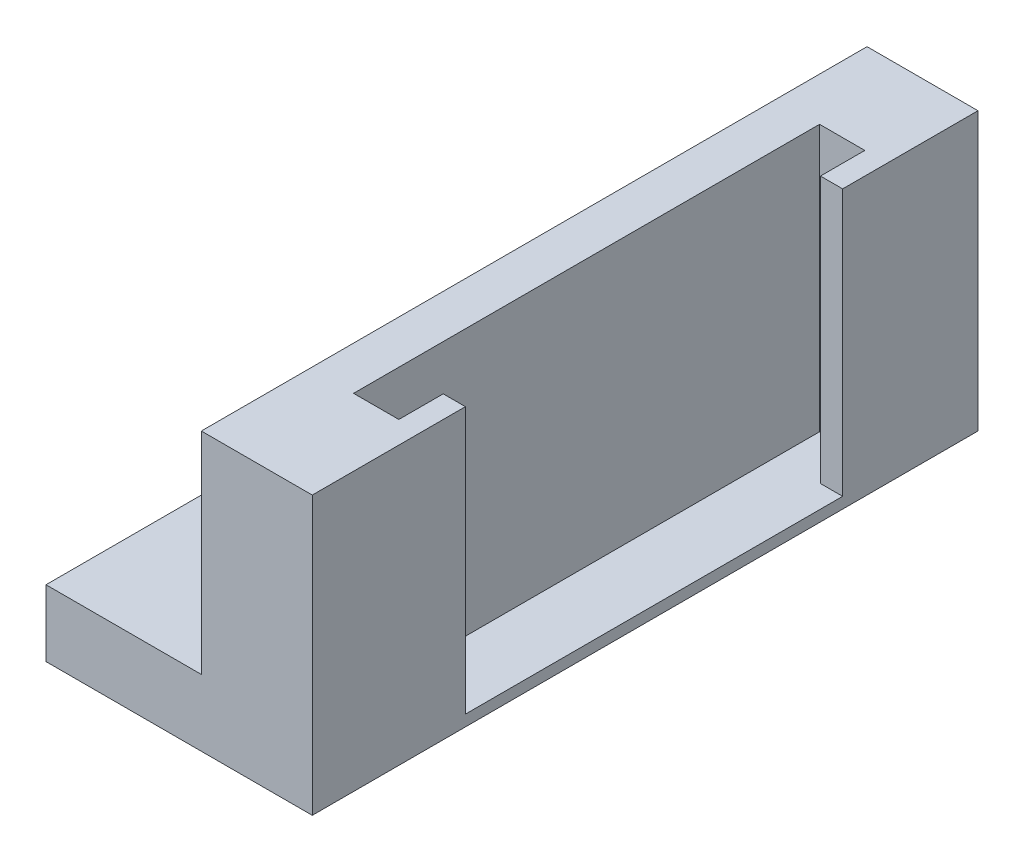
ISO-10303-21;
HEADER;
FILE_DESCRIPTION(('STEP AP214'),'2;1');
FILE_NAME('part.step','',(''),(''),'','','');
FILE_SCHEMA(('AUTOMOTIVE_DESIGN { 1 0 10303 214 1 1 1 1 }'));
ENDSEC;
DATA;
#1=APPLICATION_CONTEXT('core data for automotive mechanical design processes');
#2=APPLICATION_PROTOCOL_DEFINITION('international standard','automotive_design',2000,#1);
#3=PRODUCT_CONTEXT('',#1,'mechanical');
#4=PRODUCT('Part','Part','',(#3));
#5=PRODUCT_RELATED_PRODUCT_CATEGORY('part','',(#4));
#6=PRODUCT_DEFINITION_FORMATION('','',#4);
#7=PRODUCT_DEFINITION_CONTEXT('part definition',#1,'design');
#8=PRODUCT_DEFINITION('design','',#6,#7);
#9=PRODUCT_DEFINITION_SHAPE('','',#8);
#10=(LENGTH_UNIT() NAMED_UNIT(*) SI_UNIT(.MILLI.,.METRE.));
#11=(NAMED_UNIT(*) PLANE_ANGLE_UNIT() SI_UNIT($,.RADIAN.));
#12=(NAMED_UNIT(*) SI_UNIT($,.STERADIAN.) SOLID_ANGLE_UNIT());
#13=UNCERTAINTY_MEASURE_WITH_UNIT(LENGTH_MEASURE(1.E-05),#10,'distance_accuracy_value','');
#14=(GEOMETRIC_REPRESENTATION_CONTEXT(3) GLOBAL_UNCERTAINTY_ASSIGNED_CONTEXT((#13)) GLOBAL_UNIT_ASSIGNED_CONTEXT((#10,
#11,#12)) REPRESENTATION_CONTEXT('',''));
#15=CARTESIAN_POINT('',(0.,0.,0.));
#16=DIRECTION('',(0.,0.,1.));
#17=DIRECTION('',(1.,0.,0.));
#18=AXIS2_PLACEMENT_3D('',#15,#16,#17);
#19=CARTESIAN_POINT('',(0.,0.,30.));
#20=DIRECTION('',(0.,1.,0.));
#21=DIRECTION('',(0.,0.,1.));
#22=AXIS2_PLACEMENT_3D('',#19,#20,#21);
#23=PLANE('',#22);
#24=CARTESIAN_POINT('',(3.5,0.,24.));
#25=DIRECTION('',(0.,1.,0.));
#26=DIRECTION('',(0.,0.,1.));
#27=AXIS2_PLACEMENT_3D('',#24,#25,#26);
#28=CIRCLE('',#27,1.65);
#29=CARTESIAN_POINT('',(3.5,0.,25.65));
#30=VERTEX_POINT('',#29);
#31=EDGE_CURVE('E247',#30,#30,#28,.F.);
#32=ORIENTED_EDGE('',*,*,#31,.F.);
#33=EDGE_LOOP('',(#32));
#34=FACE_BOUND('',#33,.T.);
#35=CARTESIAN_POINT('',(3.5,0.,6.));
#36=DIRECTION('',(0.,1.,0.));
#37=DIRECTION('',(0.,0.,1.));
#38=AXIS2_PLACEMENT_3D('',#35,#36,#37);
#39=CIRCLE('',#38,1.65);
#40=CARTESIAN_POINT('',(3.5,0.,7.65));
#41=VERTEX_POINT('',#40);
#42=EDGE_CURVE('E278',#41,#41,#39,.F.);
#43=ORIENTED_EDGE('',*,*,#42,.F.);
#44=EDGE_LOOP('',(#43));
#45=FACE_BOUND('',#44,.T.);
#46=DIRECTION('',(1.,0.,0.));
#47=VECTOR('',#46,1.);
#48=CARTESIAN_POINT('',(0.,0.,0.));
#49=LINE('',#48,#47);
#50=CARTESIAN_POINT('',(0.,0.,0.));
#51=VERTEX_POINT('',#50);
#52=CARTESIAN_POINT('',(12.,0.,0.));
#53=VERTEX_POINT('',#52);
#54=EDGE_CURVE('E140',#51,#53,#49,.T.);
#55=ORIENTED_EDGE('',*,*,#54,.T.);
#56=DIRECTION('',(0.,0.,-1.));
#57=VECTOR('',#56,1.);
#58=CARTESIAN_POINT('',(12.,0.,30.));
#59=LINE('',#58,#57);
#60=CARTESIAN_POINT('',(12.,0.,30.));
#61=VERTEX_POINT('',#60);
#62=EDGE_CURVE('E11',#61,#53,#59,.T.);
#63=ORIENTED_EDGE('',*,*,#62,.F.);
#64=DIRECTION('',(1.,0.,0.));
#65=VECTOR('',#64,1.);
#66=CARTESIAN_POINT('',(0.,0.,30.));
#67=LINE('',#66,#65);
#68=CARTESIAN_POINT('',(0.,0.,30.));
#69=VERTEX_POINT('',#68);
#70=EDGE_CURVE('E159',#69,#61,#67,.T.);
#71=ORIENTED_EDGE('',*,*,#70,.F.);
#72=DIRECTION('',(0.,0.,-1.));
#73=VECTOR('',#72,1.);
#74=CARTESIAN_POINT('',(0.,0.,30.));
#75=LINE('',#74,#73);
#76=EDGE_CURVE('E136',#69,#51,#75,.T.);
#77=ORIENTED_EDGE('',*,*,#76,.T.);
#78=EDGE_LOOP('',(#55,#63,#71,#77));
#79=FACE_BOUND('',#78,.T.);
#80=ADVANCED_FACE('F39',(#34,#45,#79),#23,.F.);
#81=CARTESIAN_POINT('',(12.,0.,30.));
#82=DIRECTION('',(-1.,0.,0.));
#83=DIRECTION('',(0.,0.,1.));
#84=AXIS2_PLACEMENT_3D('',#81,#82,#83);
#85=PLANE('',#84);
#86=DIRECTION('',(0.,0.,-1.));
#87=VECTOR('',#86,1.);
#88=CARTESIAN_POINT('',(12.,12.5,30.));
#89=LINE('',#88,#87);
#90=CARTESIAN_POINT('',(12.,12.5,6.1));
#91=VERTEX_POINT('',#90);
#92=CARTESIAN_POINT('',(12.,12.5,0.));
#93=VERTEX_POINT('',#92);
#94=EDGE_CURVE('E165',#91,#93,#89,.T.);
#95=ORIENTED_EDGE('',*,*,#94,.F.);
#96=DIRECTION('',(0.,1.,0.));
#97=VECTOR('',#96,1.);
#98=CARTESIAN_POINT('',(12.,0.499999999999995,6.1));
#99=LINE('',#98,#97);
#100=CARTESIAN_POINT('',(12.,0.499999999999995,6.1));
#101=VERTEX_POINT('',#100);
#102=EDGE_CURVE('E145',#101,#91,#99,.T.);
#103=ORIENTED_EDGE('',*,*,#102,.F.);
#104=DIRECTION('',(0.,0.,-1.));
#105=VECTOR('',#104,1.);
#106=CARTESIAN_POINT('',(12.,0.499999999999995,0.));
#107=LINE('',#106,#105);
#108=CARTESIAN_POINT('',(12.,0.499999999999995,23.1));
#109=VERTEX_POINT('',#108);
#110=EDGE_CURVE('E195',#109,#101,#107,.T.);
#111=ORIENTED_EDGE('',*,*,#110,.F.);
#112=DIRECTION('',(0.,1.,0.));
#113=VECTOR('',#112,1.);
#114=CARTESIAN_POINT('',(12.,0.499999999999995,23.1));
#115=LINE('',#114,#113);
#116=CARTESIAN_POINT('',(12.,12.5,23.1));
#117=VERTEX_POINT('',#116);
#118=EDGE_CURVE('E215',#109,#117,#115,.T.);
#119=ORIENTED_EDGE('',*,*,#118,.T.);
#120=CARTESIAN_POINT('',(12.,12.5,30.));
#121=VERTEX_POINT('',#120);
#122=EDGE_CURVE('E47',#121,#117,#89,.T.);
#123=ORIENTED_EDGE('',*,*,#122,.F.);
#124=DIRECTION('',(0.,1.,0.));
#125=VECTOR('',#124,1.);
#126=CARTESIAN_POINT('',(12.,0.,30.));
#127=LINE('',#126,#125);
#128=EDGE_CURVE('E98',#61,#121,#127,.T.);
#129=ORIENTED_EDGE('',*,*,#128,.F.);
#130=ORIENTED_EDGE('',*,*,#62,.T.);
#131=DIRECTION('',(0.,1.,0.));
#132=VECTOR('',#131,1.);
#133=CARTESIAN_POINT('',(12.,0.,0.));
#134=LINE('',#133,#132);
#135=EDGE_CURVE('E144',#53,#93,#134,.T.);
#136=ORIENTED_EDGE('',*,*,#135,.T.);
#137=EDGE_LOOP('',(#95,#103,#111,#119,#123,#129,#130,#136));
#138=FACE_BOUND('',#137,.T.);
#139=ADVANCED_FACE('F177',(#138),#85,.F.);
#140=CARTESIAN_POINT('',(12.,12.5,30.));
#141=DIRECTION('',(0.,-1.,0.));
#142=DIRECTION('',(1.,0.,0.));
#143=AXIS2_PLACEMENT_3D('',#140,#141,#142);
#144=PLANE('',#143);
#145=DIRECTION('',(0.,0.,-1.));
#146=VECTOR('',#145,1.);
#147=CARTESIAN_POINT('',(11.,12.5,0.));
#148=LINE('',#147,#146);
#149=CARTESIAN_POINT('',(11.,12.5,6.09999999999999));
#150=VERTEX_POINT('',#149);
#151=CARTESIAN_POINT('',(11.,12.5,4.1));
#152=VERTEX_POINT('',#151);
#153=EDGE_CURVE('E241',#150,#152,#148,.T.);
#154=ORIENTED_EDGE('',*,*,#153,.F.);
#155=DIRECTION('',(-1.,0.,0.));
#156=VECTOR('',#155,1.);
#157=CARTESIAN_POINT('',(0.,12.5,6.1));
#158=LINE('',#157,#156);
#159=EDGE_CURVE('E54',#91,#150,#158,.T.);
#160=ORIENTED_EDGE('',*,*,#159,.F.);
#161=ORIENTED_EDGE('',*,*,#94,.T.);
#162=DIRECTION('',(-1.,0.,0.));
#163=VECTOR('',#162,1.);
#164=CARTESIAN_POINT('',(12.,12.5,0.));
#165=LINE('',#164,#163);
#166=CARTESIAN_POINT('',(7.,12.5,0.));
#167=VERTEX_POINT('',#166);
#168=EDGE_CURVE('E149',#93,#167,#165,.T.);
#169=ORIENTED_EDGE('',*,*,#168,.T.);
#170=DIRECTION('',(0.,0.,-1.));
#171=VECTOR('',#170,1.);
#172=CARTESIAN_POINT('',(7.,12.5,30.));
#173=LINE('',#172,#171);
#174=CARTESIAN_POINT('',(7.,12.5,30.));
#175=VERTEX_POINT('',#174);
#176=EDGE_CURVE('E129',#175,#167,#173,.T.);
#177=ORIENTED_EDGE('',*,*,#176,.F.);
#178=DIRECTION('',(-1.,0.,0.));
#179=VECTOR('',#178,1.);
#180=CARTESIAN_POINT('',(12.,12.5,30.));
#181=LINE('',#180,#179);
#182=EDGE_CURVE('E115',#121,#175,#181,.T.);
#183=ORIENTED_EDGE('',*,*,#182,.F.);
#184=ORIENTED_EDGE('',*,*,#122,.T.);
#185=DIRECTION('',(-1.,0.,0.));
#186=VECTOR('',#185,1.);
#187=CARTESIAN_POINT('',(0.,12.5,23.1));
#188=LINE('',#187,#186);
#189=CARTESIAN_POINT('',(11.,12.5,23.1));
#190=VERTEX_POINT('',#189);
#191=EDGE_CURVE('E221',#117,#190,#188,.T.);
#192=ORIENTED_EDGE('',*,*,#191,.T.);
#193=DIRECTION('',(0.,0.,1.));
#194=VECTOR('',#193,1.);
#195=CARTESIAN_POINT('',(11.,12.5,0.));
#196=LINE('',#195,#194);
#197=CARTESIAN_POINT('',(11.,12.5,25.1));
#198=VERTEX_POINT('',#197);
#199=EDGE_CURVE('E225',#190,#198,#196,.T.);
#200=ORIENTED_EDGE('',*,*,#199,.T.);
#201=DIRECTION('',(-1.,0.,0.));
#202=VECTOR('',#201,1.);
#203=CARTESIAN_POINT('',(0.,12.5,25.1));
#204=LINE('',#203,#202);
#205=CARTESIAN_POINT('',(8.96,12.5,25.1));
#206=VERTEX_POINT('',#205);
#207=EDGE_CURVE('E229',#198,#206,#204,.T.);
#208=ORIENTED_EDGE('',*,*,#207,.T.);
#209=DIRECTION('',(0.,0.,-1.));
#210=VECTOR('',#209,1.);
#211=CARTESIAN_POINT('',(8.96,12.5,0.));
#212=LINE('',#211,#210);
#213=CARTESIAN_POINT('',(8.96,12.5,4.1));
#214=VERTEX_POINT('',#213);
#215=EDGE_CURVE('E233',#206,#214,#212,.T.);
#216=ORIENTED_EDGE('',*,*,#215,.T.);
#217=DIRECTION('',(-1.,0.,0.));
#218=VECTOR('',#217,1.);
#219=CARTESIAN_POINT('',(0.,12.5,4.1));
#220=LINE('',#219,#218);
#221=EDGE_CURVE('E237',#152,#214,#220,.T.);
#222=ORIENTED_EDGE('',*,*,#221,.F.);
#223=EDGE_LOOP('',(#154,#160,#161,#169,#177,#183,#184,#192,#200,#208,#216,#222));
#224=FACE_BOUND('',#223,.T.);
#225=ADVANCED_FACE('F174',(#224),#144,.F.);
#226=CARTESIAN_POINT('',(7.,12.5,30.));
#227=DIRECTION('',(1.,0.,0.));
#228=DIRECTION('',(0.,1.,0.));
#229=AXIS2_PLACEMENT_3D('',#226,#227,#228);
#230=PLANE('',#229);
#231=DIRECTION('',(0.,-1.,0.));
#232=VECTOR('',#231,1.);
#233=CARTESIAN_POINT('',(7.,12.5,0.));
#234=LINE('',#233,#232);
#235=CARTESIAN_POINT('',(7.,3.,0.));
#236=VERTEX_POINT('',#235);
#237=EDGE_CURVE('E125',#167,#236,#234,.T.);
#238=ORIENTED_EDGE('',*,*,#237,.T.);
#239=DIRECTION('',(0.,0.,-1.));
#240=VECTOR('',#239,1.);
#241=CARTESIAN_POINT('',(7.,3.,30.));
#242=LINE('',#241,#240);
#243=CARTESIAN_POINT('',(7.,3.,30.));
#244=VERTEX_POINT('',#243);
#245=EDGE_CURVE('E122',#244,#236,#242,.T.);
#246=ORIENTED_EDGE('',*,*,#245,.F.);
#247=DIRECTION('',(0.,-1.,0.));
#248=VECTOR('',#247,1.);
#249=CARTESIAN_POINT('',(7.,12.5,30.));
#250=LINE('',#249,#248);
#251=EDGE_CURVE('E108',#175,#244,#250,.T.);
#252=ORIENTED_EDGE('',*,*,#251,.F.);
#253=ORIENTED_EDGE('',*,*,#176,.T.);
#254=EDGE_LOOP('',(#238,#246,#252,#253));
#255=FACE_BOUND('',#254,.T.);
#256=ADVANCED_FACE('F123',(#255),#230,.F.);
#257=CARTESIAN_POINT('',(7.,3.,30.));
#258=DIRECTION('',(0.,-1.,0.));
#259=DIRECTION('',(1.,0.,0.));
#260=AXIS2_PLACEMENT_3D('',#257,#258,#259);
#261=PLANE('',#260);
#262=CARTESIAN_POINT('',(3.5,3.,24.));
#263=DIRECTION('',(0.,1.,0.));
#264=DIRECTION('',(0.,0.,-1.));
#265=AXIS2_PLACEMENT_3D('',#262,#263,#264);
#266=CIRCLE('',#265,1.65);
#267=CARTESIAN_POINT('',(3.5,3.,25.65));
#268=VERTEX_POINT('',#267);
#269=EDGE_CURVE('E282',#268,#268,#266,.T.);
#270=ORIENTED_EDGE('',*,*,#269,.F.);
#271=EDGE_LOOP('',(#270));
#272=FACE_BOUND('',#271,.T.);
#273=CARTESIAN_POINT('',(3.5,3.,6.));
#274=DIRECTION('',(0.,1.,0.));
#275=DIRECTION('',(0.,0.,1.));
#276=AXIS2_PLACEMENT_3D('',#273,#274,#275);
#277=CIRCLE('',#276,1.65);
#278=CARTESIAN_POINT('',(3.5,3.,7.65));
#279=VERTEX_POINT('',#278);
#280=EDGE_CURVE('E283',#279,#279,#277,.T.);
#281=ORIENTED_EDGE('',*,*,#280,.F.);
#282=EDGE_LOOP('',(#281));
#283=FACE_BOUND('',#282,.T.);
#284=DIRECTION('',(-1.,0.,0.));
#285=VECTOR('',#284,1.);
#286=CARTESIAN_POINT('',(7.,3.,0.));
#287=LINE('',#286,#285);
#288=CARTESIAN_POINT('',(0.,3.,0.));
#289=VERTEX_POINT('',#288);
#290=EDGE_CURVE('E154',#236,#289,#287,.T.);
#291=ORIENTED_EDGE('',*,*,#290,.T.);
#292=DIRECTION('',(0.,0.,-1.));
#293=VECTOR('',#292,1.);
#294=CARTESIAN_POINT('',(0.,3.,30.));
#295=LINE('',#294,#293);
#296=CARTESIAN_POINT('',(0.,3.,30.));
#297=VERTEX_POINT('',#296);
#298=EDGE_CURVE('E130',#297,#289,#295,.T.);
#299=ORIENTED_EDGE('',*,*,#298,.F.);
#300=DIRECTION('',(-1.,0.,0.));
#301=VECTOR('',#300,1.);
#302=CARTESIAN_POINT('',(7.,3.,30.));
#303=LINE('',#302,#301);
#304=EDGE_CURVE('E112',#244,#297,#303,.T.);
#305=ORIENTED_EDGE('',*,*,#304,.F.);
#306=ORIENTED_EDGE('',*,*,#245,.T.);
#307=EDGE_LOOP('',(#291,#299,#305,#306));
#308=FACE_BOUND('',#307,.T.);
#309=ADVANCED_FACE('F132',(#272,#283,#308),#261,.F.);
#310=CARTESIAN_POINT('',(0.,3.,30.));
#311=DIRECTION('',(1.,0.,0.));
#312=DIRECTION('',(0.,1.,0.));
#313=AXIS2_PLACEMENT_3D('',#310,#311,#312);
#314=PLANE('',#313);
#315=DIRECTION('',(0.,-1.,0.));
#316=VECTOR('',#315,1.);
#317=CARTESIAN_POINT('',(0.,3.,0.));
#318=LINE('',#317,#316);
#319=EDGE_CURVE('E90',#289,#51,#318,.T.);
#320=ORIENTED_EDGE('',*,*,#319,.T.);
#321=ORIENTED_EDGE('',*,*,#76,.F.);
#322=DIRECTION('',(0.,-1.,0.));
#323=VECTOR('',#322,1.);
#324=CARTESIAN_POINT('',(0.,3.,30.));
#325=LINE('',#324,#323);
#326=EDGE_CURVE('E63',#297,#69,#325,.T.);
#327=ORIENTED_EDGE('',*,*,#326,.F.);
#328=ORIENTED_EDGE('',*,*,#298,.T.);
#329=EDGE_LOOP('',(#320,#321,#327,#328));
#330=FACE_BOUND('',#329,.T.);
#331=ADVANCED_FACE('F182',(#330),#314,.F.);
#332=CARTESIAN_POINT('',(0.,0.,30.));
#333=DIRECTION('',(0.,0.,1.));
#334=DIRECTION('',(1.,0.,0.));
#335=AXIS2_PLACEMENT_3D('',#332,#333,#334);
#336=PLANE('',#335);
#337=ORIENTED_EDGE('',*,*,#70,.T.);
#338=ORIENTED_EDGE('',*,*,#128,.T.);
#339=ORIENTED_EDGE('',*,*,#182,.T.);
#340=ORIENTED_EDGE('',*,*,#251,.T.);
#341=ORIENTED_EDGE('',*,*,#304,.T.);
#342=ORIENTED_EDGE('',*,*,#326,.T.);
#343=EDGE_LOOP('',(#337,#338,#339,#340,#341,#342));
#344=FACE_BOUND('',#343,.T.);
#345=ADVANCED_FACE('F110',(#344),#336,.T.);
#346=CARTESIAN_POINT('',(0.,0.,0.));
#347=DIRECTION('',(0.,0.,1.));
#348=DIRECTION('',(1.,0.,0.));
#349=AXIS2_PLACEMENT_3D('',#346,#347,#348);
#350=PLANE('',#349);
#351=ORIENTED_EDGE('',*,*,#54,.F.);
#352=ORIENTED_EDGE('',*,*,#319,.F.);
#353=ORIENTED_EDGE('',*,*,#290,.F.);
#354=ORIENTED_EDGE('',*,*,#237,.F.);
#355=ORIENTED_EDGE('',*,*,#168,.F.);
#356=ORIENTED_EDGE('',*,*,#135,.F.);
#357=EDGE_LOOP('',(#351,#352,#353,#354,#355,#356));
#358=FACE_BOUND('',#357,.T.);
#359=ADVANCED_FACE('F181',(#358),#350,.F.);
#360=CARTESIAN_POINT('',(0.,0.499999999999995,6.1));
#361=DIRECTION('',(0.,0.,-1.));
#362=DIRECTION('',(-1.,0.,0.));
#363=AXIS2_PLACEMENT_3D('',#360,#361,#362);
#364=PLANE('',#363);
#365=ORIENTED_EDGE('',*,*,#159,.T.);
#366=DIRECTION('',(0.,1.,0.));
#367=VECTOR('',#366,1.);
#368=CARTESIAN_POINT('',(11.,0.499999999999995,6.1));
#369=LINE('',#368,#367);
#370=CARTESIAN_POINT('',(11.,0.499999999999995,6.1));
#371=VERTEX_POINT('',#370);
#372=EDGE_CURVE('E190',#371,#150,#369,.T.);
#373=ORIENTED_EDGE('',*,*,#372,.F.);
#374=DIRECTION('',(-1.,0.,0.));
#375=VECTOR('',#374,1.);
#376=CARTESIAN_POINT('',(0.,0.499999999999995,6.1));
#377=LINE('',#376,#375);
#378=EDGE_CURVE('E224',#101,#371,#377,.T.);
#379=ORIENTED_EDGE('',*,*,#378,.F.);
#380=ORIENTED_EDGE('',*,*,#102,.T.);
#381=EDGE_LOOP('',(#365,#373,#379,#380));
#382=FACE_BOUND('',#381,.T.);
#383=ADVANCED_FACE('F328',(#382),#364,.F.);
#384=CARTESIAN_POINT('',(0.,0.499999999999995,23.1));
#385=DIRECTION('',(0.,0.,-1.));
#386=DIRECTION('',(-1.,0.,0.));
#387=AXIS2_PLACEMENT_3D('',#384,#385,#386);
#388=PLANE('',#387);
#389=ORIENTED_EDGE('',*,*,#191,.F.);
#390=ORIENTED_EDGE('',*,*,#118,.F.);
#391=DIRECTION('',(-1.,0.,0.));
#392=VECTOR('',#391,1.);
#393=CARTESIAN_POINT('',(0.,0.499999999999995,23.1));
#394=LINE('',#393,#392);
#395=CARTESIAN_POINT('',(11.,0.499999999999995,23.1));
#396=VERTEX_POINT('',#395);
#397=EDGE_CURVE('E251',#109,#396,#394,.T.);
#398=ORIENTED_EDGE('',*,*,#397,.T.);
#399=DIRECTION('',(0.,1.,0.));
#400=VECTOR('',#399,1.);
#401=CARTESIAN_POINT('',(11.,0.499999999999995,23.1));
#402=LINE('',#401,#400);
#403=EDGE_CURVE('E211',#396,#190,#402,.T.);
#404=ORIENTED_EDGE('',*,*,#403,.T.);
#405=EDGE_LOOP('',(#389,#390,#398,#404));
#406=FACE_BOUND('',#405,.T.);
#407=ADVANCED_FACE('F324',(#406),#388,.T.);
#408=CARTESIAN_POINT('',(11.,0.499999999999995,0.));
#409=DIRECTION('',(-1.,0.,0.));
#410=DIRECTION('',(0.,0.,1.));
#411=AXIS2_PLACEMENT_3D('',#408,#409,#410);
#412=PLANE('',#411);
#413=ORIENTED_EDGE('',*,*,#199,.F.);
#414=ORIENTED_EDGE('',*,*,#403,.F.);
#415=DIRECTION('',(0.,0.,1.));
#416=VECTOR('',#415,1.);
#417=CARTESIAN_POINT('',(11.,0.499999999999995,0.));
#418=LINE('',#417,#416);
#419=CARTESIAN_POINT('',(11.,0.499999999999995,25.1));
#420=VERTEX_POINT('',#419);
#421=EDGE_CURVE('E255',#396,#420,#418,.T.);
#422=ORIENTED_EDGE('',*,*,#421,.T.);
#423=DIRECTION('',(0.,1.,0.));
#424=VECTOR('',#423,1.);
#425=CARTESIAN_POINT('',(11.,0.499999999999995,25.1));
#426=LINE('',#425,#424);
#427=EDGE_CURVE('E207',#420,#198,#426,.T.);
#428=ORIENTED_EDGE('',*,*,#427,.T.);
#429=EDGE_LOOP('',(#413,#414,#422,#428));
#430=FACE_BOUND('',#429,.T.);
#431=ADVANCED_FACE('F327',(#430),#412,.T.);
#432=CARTESIAN_POINT('',(0.,0.499999999999995,25.1));
#433=DIRECTION('',(0.,0.,-1.));
#434=DIRECTION('',(-1.,0.,0.));
#435=AXIS2_PLACEMENT_3D('',#432,#433,#434);
#436=PLANE('',#435);
#437=ORIENTED_EDGE('',*,*,#207,.F.);
#438=ORIENTED_EDGE('',*,*,#427,.F.);
#439=DIRECTION('',(-1.,0.,0.));
#440=VECTOR('',#439,1.);
#441=CARTESIAN_POINT('',(0.,0.499999999999995,25.1));
#442=LINE('',#441,#440);
#443=CARTESIAN_POINT('',(8.96,0.499999999999995,25.1));
#444=VERTEX_POINT('',#443);
#445=EDGE_CURVE('E259',#420,#444,#442,.T.);
#446=ORIENTED_EDGE('',*,*,#445,.T.);
#447=DIRECTION('',(0.,1.,0.));
#448=VECTOR('',#447,1.);
#449=CARTESIAN_POINT('',(8.96,0.499999999999995,25.1));
#450=LINE('',#449,#448);
#451=EDGE_CURVE('E203',#444,#206,#450,.T.);
#452=ORIENTED_EDGE('',*,*,#451,.T.);
#453=EDGE_LOOP('',(#437,#438,#446,#452));
#454=FACE_BOUND('',#453,.T.);
#455=ADVANCED_FACE('F332',(#454),#436,.T.);
#456=CARTESIAN_POINT('',(8.96,0.499999999999995,0.));
#457=DIRECTION('',(1.,0.,0.));
#458=DIRECTION('',(0.,0.,-1.));
#459=AXIS2_PLACEMENT_3D('',#456,#457,#458);
#460=PLANE('',#459);
#461=ORIENTED_EDGE('',*,*,#215,.F.);
#462=ORIENTED_EDGE('',*,*,#451,.F.);
#463=DIRECTION('',(0.,0.,-1.));
#464=VECTOR('',#463,1.);
#465=CARTESIAN_POINT('',(8.96,0.499999999999995,0.));
#466=LINE('',#465,#464);
#467=CARTESIAN_POINT('',(8.96,0.499999999999995,4.1));
#468=VERTEX_POINT('',#467);
#469=EDGE_CURVE('E263',#444,#468,#466,.T.);
#470=ORIENTED_EDGE('',*,*,#469,.T.);
#471=DIRECTION('',(0.,1.,0.));
#472=VECTOR('',#471,1.);
#473=CARTESIAN_POINT('',(8.96,0.499999999999995,4.1));
#474=LINE('',#473,#472);
#475=EDGE_CURVE('E199',#468,#214,#474,.T.);
#476=ORIENTED_EDGE('',*,*,#475,.T.);
#477=EDGE_LOOP('',(#461,#462,#470,#476));
#478=FACE_BOUND('',#477,.T.);
#479=ADVANCED_FACE('F336',(#478),#460,.T.);
#480=CARTESIAN_POINT('',(0.,0.499999999999995,4.1));
#481=DIRECTION('',(0.,0.,-1.));
#482=DIRECTION('',(-1.,0.,0.));
#483=AXIS2_PLACEMENT_3D('',#480,#481,#482);
#484=PLANE('',#483);
#485=ORIENTED_EDGE('',*,*,#221,.T.);
#486=ORIENTED_EDGE('',*,*,#475,.F.);
#487=DIRECTION('',(-1.,0.,0.));
#488=VECTOR('',#487,1.);
#489=CARTESIAN_POINT('',(0.,0.499999999999995,4.1));
#490=LINE('',#489,#488);
#491=CARTESIAN_POINT('',(11.,0.499999999999995,4.1));
#492=VERTEX_POINT('',#491);
#493=EDGE_CURVE('E267',#492,#468,#490,.T.);
#494=ORIENTED_EDGE('',*,*,#493,.F.);
#495=DIRECTION('',(0.,1.,0.));
#496=VECTOR('',#495,1.);
#497=CARTESIAN_POINT('',(11.,0.499999999999995,4.1));
#498=LINE('',#497,#496);
#499=EDGE_CURVE('E194',#492,#152,#498,.T.);
#500=ORIENTED_EDGE('',*,*,#499,.T.);
#501=EDGE_LOOP('',(#485,#486,#494,#500));
#502=FACE_BOUND('',#501,.T.);
#503=ADVANCED_FACE('F340',(#502),#484,.F.);
#504=CARTESIAN_POINT('',(11.,0.499999999999995,0.));
#505=DIRECTION('',(1.,0.,0.));
#506=DIRECTION('',(0.,0.,-1.));
#507=AXIS2_PLACEMENT_3D('',#504,#505,#506);
#508=PLANE('',#507);
#509=ORIENTED_EDGE('',*,*,#153,.T.);
#510=ORIENTED_EDGE('',*,*,#499,.F.);
#511=DIRECTION('',(0.,0.,-1.));
#512=VECTOR('',#511,1.);
#513=CARTESIAN_POINT('',(11.,0.499999999999995,0.));
#514=LINE('',#513,#512);
#515=EDGE_CURVE('E271',#371,#492,#514,.T.);
#516=ORIENTED_EDGE('',*,*,#515,.F.);
#517=ORIENTED_EDGE('',*,*,#372,.T.);
#518=EDGE_LOOP('',(#509,#510,#516,#517));
#519=FACE_BOUND('',#518,.T.);
#520=ADVANCED_FACE('F322',(#519),#508,.F.);
#521=CARTESIAN_POINT('',(0.,0.499999999999995,0.));
#522=DIRECTION('',(0.,1.,0.));
#523=DIRECTION('',(0.,0.,1.));
#524=AXIS2_PLACEMENT_3D('',#521,#522,#523);
#525=PLANE('',#524);
#526=ORIENTED_EDGE('',*,*,#378,.T.);
#527=ORIENTED_EDGE('',*,*,#515,.T.);
#528=ORIENTED_EDGE('',*,*,#493,.T.);
#529=ORIENTED_EDGE('',*,*,#469,.F.);
#530=ORIENTED_EDGE('',*,*,#445,.F.);
#531=ORIENTED_EDGE('',*,*,#421,.F.);
#532=ORIENTED_EDGE('',*,*,#397,.F.);
#533=ORIENTED_EDGE('',*,*,#110,.T.);
#534=EDGE_LOOP('',(#526,#527,#528,#529,#530,#531,#532,#533));
#535=FACE_BOUND('',#534,.T.);
#536=ADVANCED_FACE('F305',(#535),#525,.T.);
#537=CARTESIAN_POINT('',(3.5,-0.00100000000000013,6.));
#538=DIRECTION('',(0.,1.,0.));
#539=DIRECTION('',(0.,0.,1.));
#540=AXIS2_PLACEMENT_3D('',#537,#538,#539);
#541=CYLINDRICAL_SURFACE('',#540,1.65);
#542=CARTESIAN_POINT('',(3.5,3.,7.65));
#543=CARTESIAN_POINT('',(3.5,2.96875,7.65));
#544=CARTESIAN_POINT('',(3.5,2.9375,7.65));
#545=CARTESIAN_POINT('',(3.5,2.875,7.65));
#546=CARTESIAN_POINT('',(3.5,2.84375,7.65));
#547=CARTESIAN_POINT('',(3.5,2.78125,7.65));
#548=CARTESIAN_POINT('',(3.5,2.75,7.65));
#549=CARTESIAN_POINT('',(3.5,2.6875,7.65));
#550=CARTESIAN_POINT('',(3.5,2.65625,7.65));
#551=CARTESIAN_POINT('',(3.5,2.59375,7.65));
#552=CARTESIAN_POINT('',(3.5,2.5625,7.65));
#553=CARTESIAN_POINT('',(3.5,2.5,7.65));
#554=CARTESIAN_POINT('',(3.5,2.46875,7.65));
#555=CARTESIAN_POINT('',(3.5,2.40625,7.65));
#556=CARTESIAN_POINT('',(3.5,2.375,7.65));
#557=CARTESIAN_POINT('',(3.5,2.3125,7.65));
#558=CARTESIAN_POINT('',(3.5,2.28125,7.65));
#559=CARTESIAN_POINT('',(3.5,2.21875,7.65));
#560=CARTESIAN_POINT('',(3.5,2.1875,7.65));
#561=CARTESIAN_POINT('',(3.5,2.125,7.65));
#562=CARTESIAN_POINT('',(3.5,2.09375,7.65));
#563=CARTESIAN_POINT('',(3.5,2.03125,7.65));
#564=CARTESIAN_POINT('',(3.5,2.,7.65));
#565=CARTESIAN_POINT('',(3.5,1.9375,7.65));
#566=CARTESIAN_POINT('',(3.5,1.90625,7.65));
#567=CARTESIAN_POINT('',(3.5,1.84375,7.65));
#568=CARTESIAN_POINT('',(3.5,1.8125,7.65));
#569=CARTESIAN_POINT('',(3.5,1.75,7.65));
#570=CARTESIAN_POINT('',(3.5,1.71875,7.65));
#571=CARTESIAN_POINT('',(3.5,1.65625,7.65));
#572=CARTESIAN_POINT('',(3.5,1.625,7.65));
#573=CARTESIAN_POINT('',(3.5,1.5625,7.65));
#574=CARTESIAN_POINT('',(3.5,1.53125,7.65));
#575=CARTESIAN_POINT('',(3.5,1.46875,7.65));
#576=CARTESIAN_POINT('',(3.5,1.4375,7.65));
#577=CARTESIAN_POINT('',(3.5,1.375,7.65));
#578=CARTESIAN_POINT('',(3.5,1.34375,7.65));
#579=CARTESIAN_POINT('',(3.5,1.28125,7.65));
#580=CARTESIAN_POINT('',(3.5,1.25,7.65));
#581=CARTESIAN_POINT('',(3.5,1.1875,7.65));
#582=CARTESIAN_POINT('',(3.5,1.15625,7.65));
#583=CARTESIAN_POINT('',(3.5,1.09375,7.65));
#584=CARTESIAN_POINT('',(3.5,1.0625,7.65));
#585=CARTESIAN_POINT('',(3.5,1.,7.65));
#586=CARTESIAN_POINT('',(3.5,0.96875,7.65));
#587=CARTESIAN_POINT('',(3.5,0.90625,7.65));
#588=CARTESIAN_POINT('',(3.5,0.875,7.65));
#589=CARTESIAN_POINT('',(3.5,0.8125,7.65));
#590=CARTESIAN_POINT('',(3.5,0.78125,7.65));
#591=CARTESIAN_POINT('',(3.5,0.71875,7.65));
#592=CARTESIAN_POINT('',(3.5,0.6875,7.65));
#593=CARTESIAN_POINT('',(3.5,0.625,7.65));
#594=CARTESIAN_POINT('',(3.5,0.59375,7.65));
#595=CARTESIAN_POINT('',(3.5,0.53125,7.65));
#596=CARTESIAN_POINT('',(3.5,0.5,7.65));
#597=CARTESIAN_POINT('',(3.5,0.4375,7.65));
#598=CARTESIAN_POINT('',(3.5,0.40625,7.65));
#599=CARTESIAN_POINT('',(3.5,0.34375,7.65));
#600=CARTESIAN_POINT('',(3.5,0.3125,7.65));
#601=CARTESIAN_POINT('',(3.5,0.25,7.65));
#602=CARTESIAN_POINT('',(3.5,0.21875,7.65));
#603=CARTESIAN_POINT('',(3.5,0.15625,7.65));
#604=CARTESIAN_POINT('',(3.5,0.125,7.65));
#605=CARTESIAN_POINT('',(3.5,0.0625000000000001,7.65));
#606=CARTESIAN_POINT('',(3.5,0.0312500000000001,7.65));
#607=CARTESIAN_POINT('',(3.5,0.,7.65));
#608=B_SPLINE_CURVE_WITH_KNOTS('',3,(#542,#543,#544,#545,#546,#547,#548,#549,#550,#551,#552,
#553,#554,#555,#556,#557,#558,#559,#560,#561,#562,#563,#564,#565,#566,#567,#568,#569,#570,#571,
#572,#573,#574,#575,#576,#577,#578,#579,#580,#581,#582,#583,#584,#585,#586,#587,#588,#589,#590,
#591,#592,#593,#594,#595,#596,#597,#598,#599,#600,#601,#602,#603,#604,#605,#606,#607),
.UNSPECIFIED.,.F.,.F.,(4,2,2,2,2,2,2,2,2,2,2,2,2,2,2,2,2,2,2,2,2,2,2,2,2,2,2,2,2,2,2,2,4),(0.,
0.0937500000000001,0.1875,0.28125,0.375,0.46875,0.5625,0.65625,0.75,0.84375,0.9375,1.03125,
1.125,1.21875,1.3125,1.40625,1.5,1.59375,1.6875,1.78125,1.875,1.96875,2.0625,2.15625,2.25,
2.34375,2.4375,2.53125,2.625,2.71875,2.8125,2.90625,3.),.UNSPECIFIED.);
#609=EDGE_CURVE('BSEAM302',#279,#41,#608,.T.);
#610=ORIENTED_EDGE('',*,*,#280,.T.);
#611=ORIENTED_EDGE('',*,*,#42,.T.);
#612=ORIENTED_EDGE('',*,*,#609,.T.);
#613=ORIENTED_EDGE('',*,*,#609,.F.);
#614=EDGE_LOOP('',(#610,#612,#611,#613));
#615=FACE_BOUND('',#614,.T.);
#616=ADVANCED_FACE('F302',(#615),#541,.F.);
#617=CARTESIAN_POINT('',(3.5,-0.00100000000000013,24.));
#618=DIRECTION('',(0.,1.,0.));
#619=DIRECTION('',(0.,0.,1.));
#620=AXIS2_PLACEMENT_3D('',#617,#618,#619);
#621=CYLINDRICAL_SURFACE('',#620,1.65);
#622=CARTESIAN_POINT('',(3.5,3.,25.65));
#623=CARTESIAN_POINT('',(3.5,2.96875,25.65));
#624=CARTESIAN_POINT('',(3.5,2.9375,25.65));
#625=CARTESIAN_POINT('',(3.5,2.875,25.65));
#626=CARTESIAN_POINT('',(3.5,2.84375,25.65));
#627=CARTESIAN_POINT('',(3.5,2.78125,25.65));
#628=CARTESIAN_POINT('',(3.5,2.75,25.65));
#629=CARTESIAN_POINT('',(3.5,2.6875,25.65));
#630=CARTESIAN_POINT('',(3.5,2.65625,25.65));
#631=CARTESIAN_POINT('',(3.5,2.59375,25.65));
#632=CARTESIAN_POINT('',(3.5,2.5625,25.65));
#633=CARTESIAN_POINT('',(3.5,2.5,25.65));
#634=CARTESIAN_POINT('',(3.5,2.46875,25.65));
#635=CARTESIAN_POINT('',(3.5,2.40625,25.65));
#636=CARTESIAN_POINT('',(3.5,2.375,25.65));
#637=CARTESIAN_POINT('',(3.5,2.3125,25.65));
#638=CARTESIAN_POINT('',(3.5,2.28125,25.65));
#639=CARTESIAN_POINT('',(3.5,2.21875,25.65));
#640=CARTESIAN_POINT('',(3.5,2.1875,25.65));
#641=CARTESIAN_POINT('',(3.5,2.125,25.65));
#642=CARTESIAN_POINT('',(3.5,2.09375,25.65));
#643=CARTESIAN_POINT('',(3.5,2.03125,25.65));
#644=CARTESIAN_POINT('',(3.5,2.,25.65));
#645=CARTESIAN_POINT('',(3.5,1.9375,25.65));
#646=CARTESIAN_POINT('',(3.5,1.90625,25.65));
#647=CARTESIAN_POINT('',(3.5,1.84375,25.65));
#648=CARTESIAN_POINT('',(3.5,1.8125,25.65));
#649=CARTESIAN_POINT('',(3.5,1.75,25.65));
#650=CARTESIAN_POINT('',(3.5,1.71875,25.65));
#651=CARTESIAN_POINT('',(3.5,1.65625,25.65));
#652=CARTESIAN_POINT('',(3.5,1.625,25.65));
#653=CARTESIAN_POINT('',(3.5,1.5625,25.65));
#654=CARTESIAN_POINT('',(3.5,1.53125,25.65));
#655=CARTESIAN_POINT('',(3.5,1.46875,25.65));
#656=CARTESIAN_POINT('',(3.5,1.4375,25.65));
#657=CARTESIAN_POINT('',(3.5,1.375,25.65));
#658=CARTESIAN_POINT('',(3.5,1.34375,25.65));
#659=CARTESIAN_POINT('',(3.5,1.28125,25.65));
#660=CARTESIAN_POINT('',(3.5,1.25,25.65));
#661=CARTESIAN_POINT('',(3.5,1.1875,25.65));
#662=CARTESIAN_POINT('',(3.5,1.15625,25.65));
#663=CARTESIAN_POINT('',(3.5,1.09375,25.65));
#664=CARTESIAN_POINT('',(3.5,1.0625,25.65));
#665=CARTESIAN_POINT('',(3.5,1.,25.65));
#666=CARTESIAN_POINT('',(3.5,0.96875,25.65));
#667=CARTESIAN_POINT('',(3.5,0.90625,25.65));
#668=CARTESIAN_POINT('',(3.5,0.875,25.65));
#669=CARTESIAN_POINT('',(3.5,0.8125,25.65));
#670=CARTESIAN_POINT('',(3.5,0.78125,25.65));
#671=CARTESIAN_POINT('',(3.5,0.71875,25.65));
#672=CARTESIAN_POINT('',(3.5,0.6875,25.65));
#673=CARTESIAN_POINT('',(3.5,0.625,25.65));
#674=CARTESIAN_POINT('',(3.5,0.59375,25.65));
#675=CARTESIAN_POINT('',(3.5,0.53125,25.65));
#676=CARTESIAN_POINT('',(3.5,0.5,25.65));
#677=CARTESIAN_POINT('',(3.5,0.4375,25.65));
#678=CARTESIAN_POINT('',(3.5,0.40625,25.65));
#679=CARTESIAN_POINT('',(3.5,0.34375,25.65));
#680=CARTESIAN_POINT('',(3.5,0.3125,25.65));
#681=CARTESIAN_POINT('',(3.5,0.25,25.65));
#682=CARTESIAN_POINT('',(3.5,0.21875,25.65));
#683=CARTESIAN_POINT('',(3.5,0.15625,25.65));
#684=CARTESIAN_POINT('',(3.5,0.125,25.65));
#685=CARTESIAN_POINT('',(3.5,0.0625000000000001,25.65));
#686=CARTESIAN_POINT('',(3.5,0.0312500000000001,25.65));
#687=CARTESIAN_POINT('',(3.5,0.,25.65));
#688=B_SPLINE_CURVE_WITH_KNOTS('',3,(#622,#623,#624,#625,#626,#627,#628,#629,#630,#631,#632,
#633,#634,#635,#636,#637,#638,#639,#640,#641,#642,#643,#644,#645,#646,#647,#648,#649,#650,#651,
#652,#653,#654,#655,#656,#657,#658,#659,#660,#661,#662,#663,#664,#665,#666,#667,#668,#669,#670,
#671,#672,#673,#674,#675,#676,#677,#678,#679,#680,#681,#682,#683,#684,#685,#686,#687),
.UNSPECIFIED.,.F.,.F.,(4,2,2,2,2,2,2,2,2,2,2,2,2,2,2,2,2,2,2,2,2,2,2,2,2,2,2,2,2,2,2,2,4),(0.,
0.0937500000000001,0.1875,0.28125,0.375,0.46875,0.5625,0.65625,0.75,0.84375,0.9375,1.03125,
1.125,1.21875,1.3125,1.40625,1.5,1.59375,1.6875,1.78125,1.875,1.96875,2.0625,2.15625,2.25,
2.34375,2.4375,2.53125,2.625,2.71875,2.8125,2.90625,3.),.UNSPECIFIED.);
#689=EDGE_CURVE('BSEAM294',#268,#30,#688,.T.);
#690=ORIENTED_EDGE('',*,*,#269,.T.);
#691=ORIENTED_EDGE('',*,*,#31,.T.);
#692=ORIENTED_EDGE('',*,*,#689,.T.);
#693=ORIENTED_EDGE('',*,*,#689,.F.);
#694=EDGE_LOOP('',(#690,#692,#691,#693));
#695=FACE_BOUND('',#694,.T.);
#696=ADVANCED_FACE('F294',(#695),#621,.F.);
#697=CLOSED_SHELL('',(#80,#139,#225,#256,#309,#331,#345,#359,#383,#407,#431,#455,#479,#503,#520,
#536,#616,#696));
#698=MANIFOLD_SOLID_BREP('B2',#697);
#699=ADVANCED_BREP_SHAPE_REPRESENTATION('',(#18,#698),#14);
#700=SHAPE_DEFINITION_REPRESENTATION(#9,#699);
ENDSEC;
END-ISO-10303-21;
